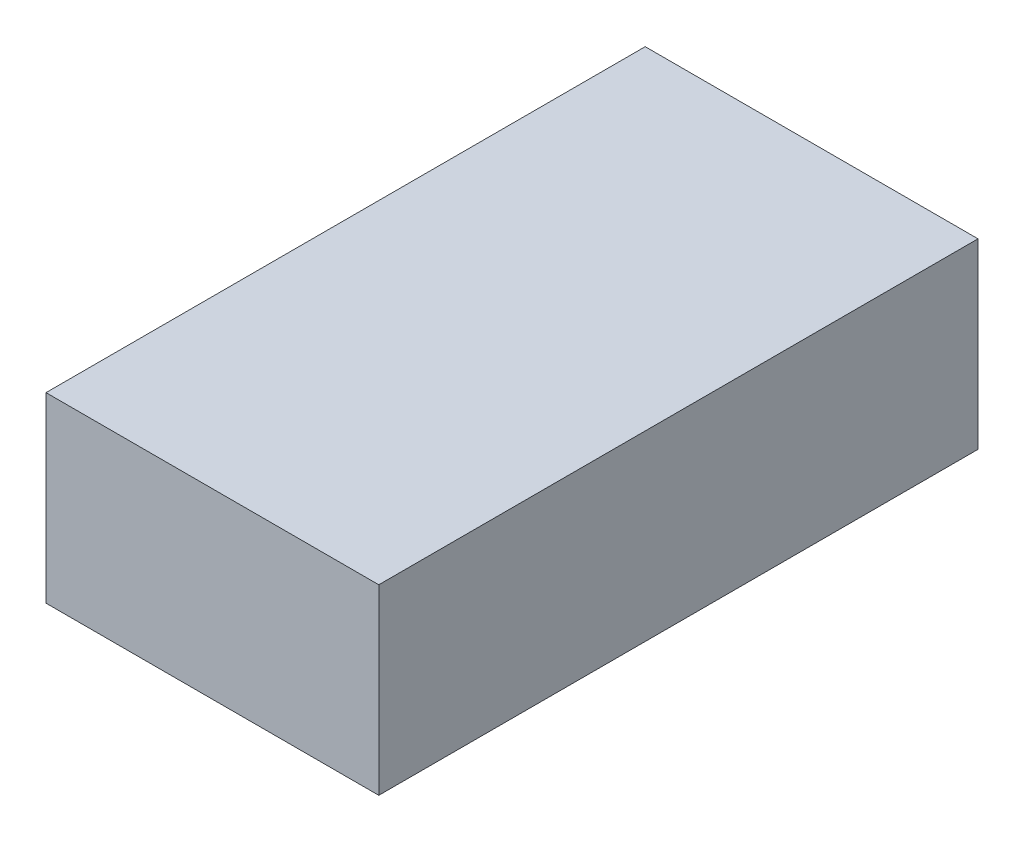
ISO-10303-21;
HEADER;
FILE_DESCRIPTION(('STEP AP214'),'2;1');
FILE_NAME('part.step','',(''),(''),'','','');
FILE_SCHEMA(('AUTOMOTIVE_DESIGN { 1 0 10303 214 1 1 1 1 }'));
ENDSEC;
DATA;
#1=APPLICATION_CONTEXT('core data for automotive mechanical design processes');
#2=APPLICATION_PROTOCOL_DEFINITION('international standard','automotive_design',2000,#1);
#3=PRODUCT_CONTEXT('',#1,'mechanical');
#4=PRODUCT('Part','Part','',(#3));
#5=PRODUCT_RELATED_PRODUCT_CATEGORY('part','',(#4));
#6=PRODUCT_DEFINITION_FORMATION('','',#4);
#7=PRODUCT_DEFINITION_CONTEXT('part definition',#1,'design');
#8=PRODUCT_DEFINITION('design','',#6,#7);
#9=PRODUCT_DEFINITION_SHAPE('','',#8);
#10=(LENGTH_UNIT() NAMED_UNIT(*) SI_UNIT(.MILLI.,.METRE.));
#11=(NAMED_UNIT(*) PLANE_ANGLE_UNIT() SI_UNIT($,.RADIAN.));
#12=(NAMED_UNIT(*) SI_UNIT($,.STERADIAN.) SOLID_ANGLE_UNIT());
#13=UNCERTAINTY_MEASURE_WITH_UNIT(LENGTH_MEASURE(1.E-05),#10,'distance_accuracy_value','');
#14=(GEOMETRIC_REPRESENTATION_CONTEXT(3) GLOBAL_UNCERTAINTY_ASSIGNED_CONTEXT((#13)) GLOBAL_UNIT_ASSIGNED_CONTEXT((#10,
#11,#12)) REPRESENTATION_CONTEXT('',''));
#15=CARTESIAN_POINT('',(0.,0.,0.));
#16=DIRECTION('',(0.,0.,1.));
#17=DIRECTION('',(1.,0.,0.));
#18=AXIS2_PLACEMENT_3D('',#15,#16,#17);
#19=CARTESIAN_POINT('',(-20.0525,15.5175,-57.113));
#20=DIRECTION('',(-1.,0.,0.));
#21=DIRECTION('',(0.,0.,1.));
#22=AXIS2_PLACEMENT_3D('',#19,#20,#21);
#23=PLANE('',#22);
#24=DIRECTION('',(0.,-1.,0.));
#25=VECTOR('',#24,1.);
#26=CARTESIAN_POINT('',(-20.0525,15.5175,0.));
#27=LINE('',#26,#25);
#28=CARTESIAN_POINT('',(-20.0525,15.5175,0.));
#29=VERTEX_POINT('',#28);
#30=CARTESIAN_POINT('',(-20.0525,-1.8635,0.));
#31=VERTEX_POINT('',#30);
#32=EDGE_CURVE('E103',#29,#31,#27,.T.);
#33=ORIENTED_EDGE('',*,*,#32,.F.);
#34=DIRECTION('',(0.,0.,1.));
#35=VECTOR('',#34,1.);
#36=CARTESIAN_POINT('',(-20.0525,15.5175,-57.113));
#37=LINE('',#36,#35);
#38=CARTESIAN_POINT('',(-20.0525,15.5175,-57.113));
#39=VERTEX_POINT('',#38);
#40=EDGE_CURVE('E11',#39,#29,#37,.T.);
#41=ORIENTED_EDGE('',*,*,#40,.F.);
#42=DIRECTION('',(0.,-1.,0.));
#43=VECTOR('',#42,1.);
#44=CARTESIAN_POINT('',(-20.0525,15.5175,-57.113));
#45=LINE('',#44,#43);
#46=CARTESIAN_POINT('',(-20.0525,-1.8635,-57.113));
#47=VERTEX_POINT('',#46);
#48=EDGE_CURVE('E98',#39,#47,#45,.T.);
#49=ORIENTED_EDGE('',*,*,#48,.T.);
#50=DIRECTION('',(0.,0.,1.));
#51=VECTOR('',#50,1.);
#52=CARTESIAN_POINT('',(-20.0525,-1.8635,-57.113));
#53=LINE('',#52,#51);
#54=EDGE_CURVE('E42',#47,#31,#53,.T.);
#55=ORIENTED_EDGE('',*,*,#54,.T.);
#56=EDGE_LOOP('',(#33,#41,#49,#55));
#57=FACE_BOUND('',#56,.T.);
#58=ADVANCED_FACE('F41',(#57),#23,.T.);
#59=CARTESIAN_POINT('',(11.6665,15.5175,-57.113));
#60=DIRECTION('',(0.,1.,0.));
#61=DIRECTION('',(0.,0.,1.));
#62=AXIS2_PLACEMENT_3D('',#59,#60,#61);
#63=PLANE('',#62);
#64=DIRECTION('',(-1.,0.,0.));
#65=VECTOR('',#64,1.);
#66=CARTESIAN_POINT('',(11.6665,15.5175,0.));
#67=LINE('',#66,#65);
#68=CARTESIAN_POINT('',(11.6665,15.5175,0.));
#69=VERTEX_POINT('',#68);
#70=EDGE_CURVE('E102',#69,#29,#67,.T.);
#71=ORIENTED_EDGE('',*,*,#70,.F.);
#72=DIRECTION('',(0.,0.,1.));
#73=VECTOR('',#72,1.);
#74=CARTESIAN_POINT('',(11.6665,15.5175,-57.113));
#75=LINE('',#74,#73);
#76=CARTESIAN_POINT('',(11.6665,15.5175,-57.113));
#77=VERTEX_POINT('',#76);
#78=EDGE_CURVE('E49',#77,#69,#75,.T.);
#79=ORIENTED_EDGE('',*,*,#78,.F.);
#80=DIRECTION('',(-1.,0.,0.));
#81=VECTOR('',#80,1.);
#82=CARTESIAN_POINT('',(11.6665,15.5175,-57.113));
#83=LINE('',#82,#81);
#84=EDGE_CURVE('E96',#77,#39,#83,.T.);
#85=ORIENTED_EDGE('',*,*,#84,.T.);
#86=ORIENTED_EDGE('',*,*,#40,.T.);
#87=EDGE_LOOP('',(#71,#79,#85,#86));
#88=FACE_BOUND('',#87,.T.);
#89=ADVANCED_FACE('F113',(#88),#63,.T.);
#90=CARTESIAN_POINT('',(11.6665,-1.8635,-57.113));
#91=DIRECTION('',(1.,0.,0.));
#92=DIRECTION('',(0.,0.,-1.));
#93=AXIS2_PLACEMENT_3D('',#90,#91,#92);
#94=PLANE('',#93);
#95=DIRECTION('',(0.,1.,0.));
#96=VECTOR('',#95,1.);
#97=CARTESIAN_POINT('',(11.6665,-1.8635,0.));
#98=LINE('',#97,#96);
#99=CARTESIAN_POINT('',(11.6665,-1.8635,0.));
#100=VERTEX_POINT('',#99);
#101=EDGE_CURVE('E91',#100,#69,#98,.T.);
#102=ORIENTED_EDGE('',*,*,#101,.F.);
#103=DIRECTION('',(0.,0.,1.));
#104=VECTOR('',#103,1.);
#105=CARTESIAN_POINT('',(11.6665,-1.8635,-57.113));
#106=LINE('',#105,#104);
#107=CARTESIAN_POINT('',(11.6665,-1.8635,-57.113));
#108=VERTEX_POINT('',#107);
#109=EDGE_CURVE('E86',#108,#100,#106,.T.);
#110=ORIENTED_EDGE('',*,*,#109,.F.);
#111=DIRECTION('',(0.,1.,0.));
#112=VECTOR('',#111,1.);
#113=CARTESIAN_POINT('',(11.6665,-1.8635,-57.113));
#114=LINE('',#113,#112);
#115=EDGE_CURVE('E87',#108,#77,#114,.T.);
#116=ORIENTED_EDGE('',*,*,#115,.T.);
#117=ORIENTED_EDGE('',*,*,#78,.T.);
#118=EDGE_LOOP('',(#102,#110,#116,#117));
#119=FACE_BOUND('',#118,.T.);
#120=ADVANCED_FACE('F88',(#119),#94,.T.);
#121=CARTESIAN_POINT('',(-20.0525,-1.8635,-57.113));
#122=DIRECTION('',(0.,-1.,0.));
#123=DIRECTION('',(0.,0.,-1.));
#124=AXIS2_PLACEMENT_3D('',#121,#122,#123);
#125=PLANE('',#124);
#126=DIRECTION('',(1.,0.,0.));
#127=VECTOR('',#126,1.);
#128=CARTESIAN_POINT('',(-20.0525,-1.8635,0.));
#129=LINE('',#128,#127);
#130=EDGE_CURVE('E110',#31,#100,#129,.T.);
#131=ORIENTED_EDGE('',*,*,#130,.F.);
#132=ORIENTED_EDGE('',*,*,#54,.F.);
#133=DIRECTION('',(1.,0.,0.));
#134=VECTOR('',#133,1.);
#135=CARTESIAN_POINT('',(-20.0525,-1.8635,-57.113));
#136=LINE('',#135,#134);
#137=EDGE_CURVE('E94',#47,#108,#136,.T.);
#138=ORIENTED_EDGE('',*,*,#137,.T.);
#139=ORIENTED_EDGE('',*,*,#109,.T.);
#140=EDGE_LOOP('',(#131,#132,#138,#139));
#141=FACE_BOUND('',#140,.T.);
#142=ADVANCED_FACE('F97',(#141),#125,.T.);
#143=CARTESIAN_POINT('',(0.,0.,-57.113));
#144=DIRECTION('',(0.,0.,1.));
#145=DIRECTION('',(1.,0.,0.));
#146=AXIS2_PLACEMENT_3D('',#143,#144,#145);
#147=PLANE('',#146);
#148=ORIENTED_EDGE('',*,*,#48,.F.);
#149=ORIENTED_EDGE('',*,*,#84,.F.);
#150=ORIENTED_EDGE('',*,*,#115,.F.);
#151=ORIENTED_EDGE('',*,*,#137,.F.);
#152=EDGE_LOOP('',(#148,#149,#150,#151));
#153=FACE_BOUND('',#152,.T.);
#154=ADVANCED_FACE('F92',(#153),#147,.F.);
#155=CARTESIAN_POINT('',(0.,0.,0.));
#156=DIRECTION('',(0.,0.,1.));
#157=DIRECTION('',(1.,0.,0.));
#158=AXIS2_PLACEMENT_3D('',#155,#156,#157);
#159=PLANE('',#158);
#160=ORIENTED_EDGE('',*,*,#32,.T.);
#161=ORIENTED_EDGE('',*,*,#130,.T.);
#162=ORIENTED_EDGE('',*,*,#101,.T.);
#163=ORIENTED_EDGE('',*,*,#70,.T.);
#164=EDGE_LOOP('',(#160,#161,#162,#163));
#165=FACE_BOUND('',#164,.T.);
#166=ADVANCED_FACE('F114',(#165),#159,.T.);
#167=CLOSED_SHELL('',(#58,#89,#120,#142,#154,#166));
#168=MANIFOLD_SOLID_BREP('B2',#167);
#169=ADVANCED_BREP_SHAPE_REPRESENTATION('',(#18,#168),#14);
#170=SHAPE_DEFINITION_REPRESENTATION(#9,#169);
ENDSEC;
END-ISO-10303-21;
